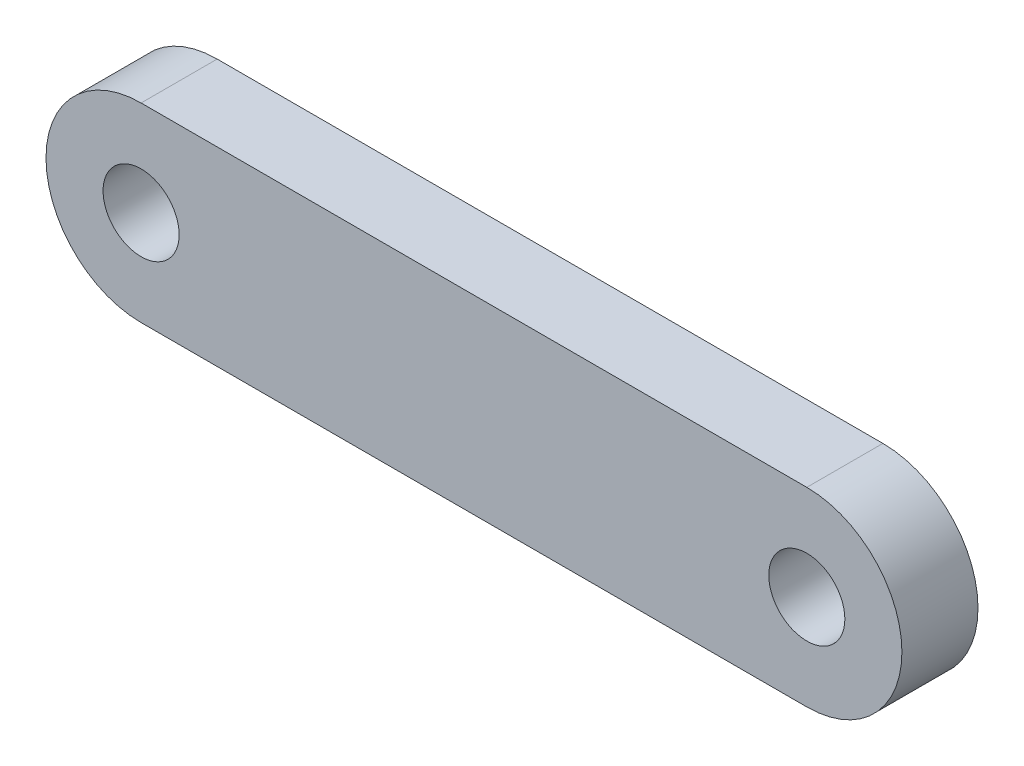
ISO-10303-21;
HEADER;
FILE_DESCRIPTION(('STEP AP214'),'2;1');
FILE_NAME('part.step','',(''),(''),'','','');
FILE_SCHEMA(('AUTOMOTIVE_DESIGN { 1 0 10303 214 1 1 1 1 }'));
ENDSEC;
DATA;
#1=APPLICATION_CONTEXT('core data for automotive mechanical design processes');
#2=APPLICATION_PROTOCOL_DEFINITION('international standard','automotive_design',2000,#1);
#3=PRODUCT_CONTEXT('',#1,'mechanical');
#4=PRODUCT('Part','Part','',(#3));
#5=PRODUCT_RELATED_PRODUCT_CATEGORY('part','',(#4));
#6=PRODUCT_DEFINITION_FORMATION('','',#4);
#7=PRODUCT_DEFINITION_CONTEXT('part definition',#1,'design');
#8=PRODUCT_DEFINITION('design','',#6,#7);
#9=PRODUCT_DEFINITION_SHAPE('','',#8);
#10=(LENGTH_UNIT() NAMED_UNIT(*) SI_UNIT(.MILLI.,.METRE.));
#11=(NAMED_UNIT(*) PLANE_ANGLE_UNIT() SI_UNIT($,.RADIAN.));
#12=(NAMED_UNIT(*) SI_UNIT($,.STERADIAN.) SOLID_ANGLE_UNIT());
#13=UNCERTAINTY_MEASURE_WITH_UNIT(LENGTH_MEASURE(1.E-05),#10,'distance_accuracy_value','');
#14=(GEOMETRIC_REPRESENTATION_CONTEXT(3) GLOBAL_UNCERTAINTY_ASSIGNED_CONTEXT((#13)) GLOBAL_UNIT_ASSIGNED_CONTEXT((#10,
#11,#12)) REPRESENTATION_CONTEXT('',''));
#15=CARTESIAN_POINT('',(0.,0.,0.));
#16=DIRECTION('',(0.,0.,1.));
#17=DIRECTION('',(1.,0.,0.));
#18=AXIS2_PLACEMENT_3D('',#15,#16,#17);
#19=CARTESIAN_POINT('',(-35.,0.,4.));
#20=DIRECTION('',(0.,0.,1.));
#21=DIRECTION('',(1.,0.,0.));
#22=AXIS2_PLACEMENT_3D('',#19,#20,#21);
#23=PLANE('',#22);
#24=CARTESIAN_POINT('',(-35.,0.,4.));
#25=DIRECTION('',(0.,0.,1.));
#26=DIRECTION('',(1.,0.,0.));
#27=AXIS2_PLACEMENT_3D('',#24,#25,#26);
#28=CIRCLE('',#27,2.);
#29=CARTESIAN_POINT('',(-33.,0.,4.));
#30=VERTEX_POINT('',#29);
#31=EDGE_CURVE('E112',#30,#30,#28,.T.);
#32=ORIENTED_EDGE('',*,*,#31,.F.);
#33=EDGE_LOOP('',(#32));
#34=FACE_BOUND('',#33,.T.);
#35=CARTESIAN_POINT('',(-35.,0.,4.));
#36=DIRECTION('',(0.,0.,1.));
#37=DIRECTION('',(1.,0.,0.));
#38=AXIS2_PLACEMENT_3D('',#35,#36,#37);
#39=CIRCLE('',#38,5.);
#40=CARTESIAN_POINT('',(-35.,5.,4.));
#41=VERTEX_POINT('',#40);
#42=CARTESIAN_POINT('',(-35.,-5.,4.));
#43=VERTEX_POINT('',#42);
#44=EDGE_CURVE('E92',#41,#43,#39,.T.);
#45=ORIENTED_EDGE('',*,*,#44,.T.);
#46=DIRECTION('',(1.,0.,0.));
#47=VECTOR('',#46,1.);
#48=CARTESIAN_POINT('',(-35.,-5.,4.));
#49=LINE('',#48,#47);
#50=CARTESIAN_POINT('',(0.,-5.,4.));
#51=VERTEX_POINT('',#50);
#52=EDGE_CURVE('E87',#43,#51,#49,.T.);
#53=ORIENTED_EDGE('',*,*,#52,.T.);
#54=CARTESIAN_POINT('',(0.,0.,4.));
#55=DIRECTION('',(0.,0.,1.));
#56=DIRECTION('',(1.,0.,0.));
#57=AXIS2_PLACEMENT_3D('',#54,#55,#56);
#58=CIRCLE('',#57,5.);
#59=CARTESIAN_POINT('',(0.,5.,4.));
#60=VERTEX_POINT('',#59);
#61=EDGE_CURVE('E90',#51,#60,#58,.T.);
#62=ORIENTED_EDGE('',*,*,#61,.T.);
#63=DIRECTION('',(-1.,0.,0.));
#64=VECTOR('',#63,1.);
#65=CARTESIAN_POINT('',(-35.,5.,4.));
#66=LINE('',#65,#64);
#67=EDGE_CURVE('E57',#60,#41,#66,.T.);
#68=ORIENTED_EDGE('',*,*,#67,.T.);
#69=EDGE_LOOP('',(#45,#53,#62,#68));
#70=FACE_BOUND('',#69,.T.);
#71=CARTESIAN_POINT('',(0.,0.,4.));
#72=DIRECTION('',(0.,0.,1.));
#73=DIRECTION('',(1.,0.,0.));
#74=AXIS2_PLACEMENT_3D('',#71,#72,#73);
#75=CIRCLE('',#74,2.);
#76=CARTESIAN_POINT('',(2.,0.,4.));
#77=VERTEX_POINT('',#76);
#78=EDGE_CURVE('E134',#77,#77,#75,.T.);
#79=ORIENTED_EDGE('',*,*,#78,.F.);
#80=EDGE_LOOP('',(#79));
#81=FACE_BOUND('',#80,.T.);
#82=ADVANCED_FACE('F39',(#34,#70,#81),#23,.T.);
#83=CARTESIAN_POINT('',(-35.,0.,0.));
#84=DIRECTION('',(0.,0.,1.));
#85=DIRECTION('',(1.,0.,0.));
#86=AXIS2_PLACEMENT_3D('',#83,#84,#85);
#87=PLANE('',#86);
#88=CARTESIAN_POINT('',(-35.,0.,0.));
#89=DIRECTION('',(0.,0.,1.));
#90=DIRECTION('',(1.,0.,0.));
#91=AXIS2_PLACEMENT_3D('',#88,#89,#90);
#92=CIRCLE('',#91,5.);
#93=CARTESIAN_POINT('',(-35.,5.,0.));
#94=VERTEX_POINT('',#93);
#95=CARTESIAN_POINT('',(-35.,-5.,0.));
#96=VERTEX_POINT('',#95);
#97=EDGE_CURVE('E108',#94,#96,#92,.T.);
#98=ORIENTED_EDGE('',*,*,#97,.F.);
#99=DIRECTION('',(-1.,0.,0.));
#100=VECTOR('',#99,1.);
#101=CARTESIAN_POINT('',(-35.,5.,0.));
#102=LINE('',#101,#100);
#103=CARTESIAN_POINT('',(0.,5.,0.));
#104=VERTEX_POINT('',#103);
#105=EDGE_CURVE('E80',#104,#94,#102,.T.);
#106=ORIENTED_EDGE('',*,*,#105,.F.);
#107=CARTESIAN_POINT('',(0.,0.,0.));
#108=DIRECTION('',(0.,0.,1.));
#109=DIRECTION('',(1.,0.,0.));
#110=AXIS2_PLACEMENT_3D('',#107,#108,#109);
#111=CIRCLE('',#110,5.);
#112=CARTESIAN_POINT('',(0.,-5.,0.));
#113=VERTEX_POINT('',#112);
#114=EDGE_CURVE('E74',#113,#104,#111,.T.);
#115=ORIENTED_EDGE('',*,*,#114,.F.);
#116=DIRECTION('',(1.,0.,0.));
#117=VECTOR('',#116,1.);
#118=CARTESIAN_POINT('',(-35.,-5.,0.));
#119=LINE('',#118,#117);
#120=EDGE_CURVE('E97',#96,#113,#119,.T.);
#121=ORIENTED_EDGE('',*,*,#120,.F.);
#122=EDGE_LOOP('',(#98,#106,#115,#121));
#123=FACE_BOUND('',#122,.T.);
#124=CARTESIAN_POINT('',(-35.,0.,0.));
#125=DIRECTION('',(0.,0.,1.));
#126=DIRECTION('',(1.,0.,0.));
#127=AXIS2_PLACEMENT_3D('',#124,#125,#126);
#128=CIRCLE('',#127,2.);
#129=CARTESIAN_POINT('',(-33.,0.,0.));
#130=VERTEX_POINT('',#129);
#131=EDGE_CURVE('E130',#130,#130,#128,.T.);
#132=ORIENTED_EDGE('',*,*,#131,.T.);
#133=EDGE_LOOP('',(#132));
#134=FACE_BOUND('',#133,.T.);
#135=CARTESIAN_POINT('',(0.,0.,0.));
#136=DIRECTION('',(0.,0.,1.));
#137=DIRECTION('',(1.,0.,0.));
#138=AXIS2_PLACEMENT_3D('',#135,#136,#137);
#139=CIRCLE('',#138,2.);
#140=CARTESIAN_POINT('',(2.,0.,0.));
#141=VERTEX_POINT('',#140);
#142=EDGE_CURVE('E138',#141,#141,#139,.T.);
#143=ORIENTED_EDGE('',*,*,#142,.T.);
#144=EDGE_LOOP('',(#143));
#145=FACE_BOUND('',#144,.T.);
#146=ADVANCED_FACE('F125',(#123,#134,#145),#87,.F.);
#147=CARTESIAN_POINT('',(-35.,0.,4.));
#148=DIRECTION('',(0.,0.,-1.));
#149=DIRECTION('',(-1.,0.,0.));
#150=AXIS2_PLACEMENT_3D('',#147,#148,#149);
#151=CYLINDRICAL_SURFACE('',#150,5.);
#152=ORIENTED_EDGE('',*,*,#97,.T.);
#153=DIRECTION('',(0.,0.,-1.));
#154=VECTOR('',#153,1.);
#155=CARTESIAN_POINT('',(-35.,-5.,4.));
#156=LINE('',#155,#154);
#157=EDGE_CURVE('E11',#43,#96,#156,.T.);
#158=ORIENTED_EDGE('',*,*,#157,.F.);
#159=ORIENTED_EDGE('',*,*,#44,.F.);
#160=DIRECTION('',(0.,0.,-1.));
#161=VECTOR('',#160,1.);
#162=CARTESIAN_POINT('',(-35.,5.,4.));
#163=LINE('',#162,#161);
#164=EDGE_CURVE('E104',#41,#94,#163,.T.);
#165=ORIENTED_EDGE('',*,*,#164,.T.);
#166=EDGE_LOOP('',(#152,#158,#159,#165));
#167=FACE_BOUND('',#166,.T.);
#168=ADVANCED_FACE('F41',(#167),#151,.T.);
#169=CARTESIAN_POINT('',(-35.,-5.,4.));
#170=DIRECTION('',(0.,1.,0.));
#171=DIRECTION('',(0.,0.,1.));
#172=AXIS2_PLACEMENT_3D('',#169,#170,#171);
#173=PLANE('',#172);
#174=ORIENTED_EDGE('',*,*,#120,.T.);
#175=DIRECTION('',(0.,0.,-1.));
#176=VECTOR('',#175,1.);
#177=CARTESIAN_POINT('',(0.,-5.,4.));
#178=LINE('',#177,#176);
#179=EDGE_CURVE('E49',#51,#113,#178,.T.);
#180=ORIENTED_EDGE('',*,*,#179,.F.);
#181=ORIENTED_EDGE('',*,*,#52,.F.);
#182=ORIENTED_EDGE('',*,*,#157,.T.);
#183=EDGE_LOOP('',(#174,#180,#181,#182));
#184=FACE_BOUND('',#183,.T.);
#185=ADVANCED_FACE('F96',(#184),#173,.F.);
#186=CARTESIAN_POINT('',(0.,0.,4.));
#187=DIRECTION('',(0.,0.,-1.));
#188=DIRECTION('',(-1.,0.,0.));
#189=AXIS2_PLACEMENT_3D('',#186,#187,#188);
#190=CYLINDRICAL_SURFACE('',#189,5.);
#191=ORIENTED_EDGE('',*,*,#114,.T.);
#192=DIRECTION('',(0.,0.,-1.));
#193=VECTOR('',#192,1.);
#194=CARTESIAN_POINT('',(0.,5.,4.));
#195=LINE('',#194,#193);
#196=EDGE_CURVE('E99',#60,#104,#195,.T.);
#197=ORIENTED_EDGE('',*,*,#196,.F.);
#198=ORIENTED_EDGE('',*,*,#61,.F.);
#199=ORIENTED_EDGE('',*,*,#179,.T.);
#200=EDGE_LOOP('',(#191,#197,#198,#199));
#201=FACE_BOUND('',#200,.T.);
#202=ADVANCED_FACE('F100',(#201),#190,.T.);
#203=CARTESIAN_POINT('',(-35.,5.,4.));
#204=DIRECTION('',(0.,-1.,0.));
#205=DIRECTION('',(0.,0.,-1.));
#206=AXIS2_PLACEMENT_3D('',#203,#204,#205);
#207=PLANE('',#206);
#208=ORIENTED_EDGE('',*,*,#105,.T.);
#209=ORIENTED_EDGE('',*,*,#164,.F.);
#210=ORIENTED_EDGE('',*,*,#67,.F.);
#211=ORIENTED_EDGE('',*,*,#196,.T.);
#212=EDGE_LOOP('',(#208,#209,#210,#211));
#213=FACE_BOUND('',#212,.T.);
#214=ADVANCED_FACE('F122',(#213),#207,.F.);
#215=CARTESIAN_POINT('',(-35.,0.,4.));
#216=DIRECTION('',(0.,0.,-1.));
#217=DIRECTION('',(-1.,0.,0.));
#218=AXIS2_PLACEMENT_3D('',#215,#216,#217);
#219=CYLINDRICAL_SURFACE('',#218,2.);
#220=ORIENTED_EDGE('',*,*,#31,.T.);
#221=EDGE_LOOP('',(#220));
#222=FACE_BOUND('',#221,.T.);
#223=ORIENTED_EDGE('',*,*,#131,.F.);
#224=EDGE_LOOP('',(#223));
#225=FACE_BOUND('',#224,.T.);
#226=ADVANCED_FACE('F157',(#222,#225),#219,.F.);
#227=CARTESIAN_POINT('',(0.,0.,4.));
#228=DIRECTION('',(0.,0.,-1.));
#229=DIRECTION('',(-1.,0.,0.));
#230=AXIS2_PLACEMENT_3D('',#227,#228,#229);
#231=CYLINDRICAL_SURFACE('',#230,2.);
#232=ORIENTED_EDGE('',*,*,#78,.T.);
#233=EDGE_LOOP('',(#232));
#234=FACE_BOUND('',#233,.T.);
#235=ORIENTED_EDGE('',*,*,#142,.F.);
#236=EDGE_LOOP('',(#235));
#237=FACE_BOUND('',#236,.T.);
#238=ADVANCED_FACE('F146',(#234,#237),#231,.F.);
#239=CLOSED_SHELL('',(#82,#146,#168,#185,#202,#214,#226,#238));
#240=MANIFOLD_SOLID_BREP('B2',#239);
#241=ADVANCED_BREP_SHAPE_REPRESENTATION('',(#18,#240),#14);
#242=SHAPE_DEFINITION_REPRESENTATION(#9,#241);
ENDSEC;
END-ISO-10303-21;
